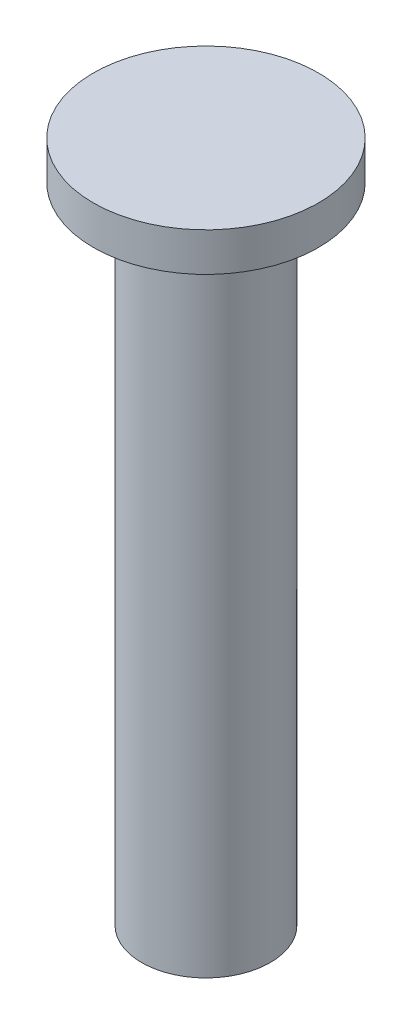
ISO-10303-21;
HEADER;
FILE_DESCRIPTION(('STEP AP214'),'2;1');
FILE_NAME('part.step','',(''),(''),'','','');
FILE_SCHEMA(('AUTOMOTIVE_DESIGN { 1 0 10303 214 1 1 1 1 }'));
ENDSEC;
DATA;
#1=APPLICATION_CONTEXT('core data for automotive mechanical design processes');
#2=APPLICATION_PROTOCOL_DEFINITION('international standard','automotive_design',2000,#1);
#3=PRODUCT_CONTEXT('',#1,'mechanical');
#4=PRODUCT('Part','Part','',(#3));
#5=PRODUCT_RELATED_PRODUCT_CATEGORY('part','',(#4));
#6=PRODUCT_DEFINITION_FORMATION('','',#4);
#7=PRODUCT_DEFINITION_CONTEXT('part definition',#1,'design');
#8=PRODUCT_DEFINITION('design','',#6,#7);
#9=PRODUCT_DEFINITION_SHAPE('','',#8);
#10=(LENGTH_UNIT() NAMED_UNIT(*) SI_UNIT(.MILLI.,.METRE.));
#11=(NAMED_UNIT(*) PLANE_ANGLE_UNIT() SI_UNIT($,.RADIAN.));
#12=(NAMED_UNIT(*) SI_UNIT($,.STERADIAN.) SOLID_ANGLE_UNIT());
#13=UNCERTAINTY_MEASURE_WITH_UNIT(LENGTH_MEASURE(1.E-05),#10,'distance_accuracy_value','');
#14=(GEOMETRIC_REPRESENTATION_CONTEXT(3) GLOBAL_UNCERTAINTY_ASSIGNED_CONTEXT((#13)) GLOBAL_UNIT_ASSIGNED_CONTEXT((#10,
#11,#12)) REPRESENTATION_CONTEXT('',''));
#15=CARTESIAN_POINT('',(0.,0.,0.));
#16=DIRECTION('',(0.,0.,1.));
#17=DIRECTION('',(1.,0.,0.));
#18=AXIS2_PLACEMENT_3D('',#15,#16,#17);
#19=CARTESIAN_POINT('',(0.,1.2,0.));
#20=DIRECTION('',(0.,-1.,0.));
#21=DIRECTION('',(0.,0.,-1.));
#22=AXIS2_PLACEMENT_3D('',#19,#20,#21);
#23=CYLINDRICAL_SURFACE('',#22,3.5);
#24=CARTESIAN_POINT('',(0.,1.2,0.));
#25=DIRECTION('',(0.,1.,0.));
#26=DIRECTION('',(0.,0.,1.));
#27=AXIS2_PLACEMENT_3D('',#24,#25,#26);
#28=CIRCLE('',#27,3.5);
#29=CARTESIAN_POINT('',(0.,1.2,3.5));
#30=VERTEX_POINT('',#29);
#31=EDGE_CURVE('E49',#30,#30,#28,.T.);
#32=ORIENTED_EDGE('',*,*,#31,.F.);
#33=EDGE_LOOP('',(#32));
#34=FACE_BOUND('',#33,.T.);
#35=CARTESIAN_POINT('',(0.,0.,0.));
#36=DIRECTION('',(0.,1.,0.));
#37=DIRECTION('',(0.,0.,1.));
#38=AXIS2_PLACEMENT_3D('',#35,#36,#37);
#39=CIRCLE('',#38,3.5);
#40=CARTESIAN_POINT('',(0.,0.,3.5));
#41=VERTEX_POINT('',#40);
#42=EDGE_CURVE('E44',#41,#41,#39,.T.);
#43=ORIENTED_EDGE('',*,*,#42,.T.);
#44=EDGE_LOOP('',(#43));
#45=FACE_BOUND('',#44,.T.);
#46=ADVANCED_FACE('F41',(#34,#45),#23,.T.);
#47=CARTESIAN_POINT('',(0.,1.2,0.));
#48=DIRECTION('',(0.,1.,0.));
#49=DIRECTION('',(0.,0.,1.));
#50=AXIS2_PLACEMENT_3D('',#47,#48,#49);
#51=PLANE('',#50);
#52=ORIENTED_EDGE('',*,*,#31,.T.);
#53=EDGE_LOOP('',(#52));
#54=FACE_BOUND('',#53,.T.);
#55=ADVANCED_FACE('F69',(#54),#51,.T.);
#56=CARTESIAN_POINT('',(0.,0.,0.));
#57=DIRECTION('',(0.,1.,0.));
#58=DIRECTION('',(0.,0.,1.));
#59=AXIS2_PLACEMENT_3D('',#56,#57,#58);
#60=PLANE('',#59);
#61=CARTESIAN_POINT('',(0.,0.,0.));
#62=DIRECTION('',(0.,-1.,0.));
#63=DIRECTION('',(0.,0.,-1.));
#64=AXIS2_PLACEMENT_3D('',#61,#62,#63);
#65=CIRCLE('',#64,2.);
#66=CARTESIAN_POINT('',(0.,0.,-2.));
#67=VERTEX_POINT('',#66);
#68=EDGE_CURVE('E10',#67,#67,#65,.T.);
#69=ORIENTED_EDGE('',*,*,#68,.F.);
#70=EDGE_LOOP('',(#69));
#71=FACE_BOUND('',#70,.T.);
#72=ORIENTED_EDGE('',*,*,#42,.F.);
#73=EDGE_LOOP('',(#72));
#74=FACE_BOUND('',#73,.T.);
#75=ADVANCED_FACE('F66',(#71,#74),#60,.F.);
#76=CARTESIAN_POINT('',(0.,-20.,0.));
#77=DIRECTION('',(0.,1.,0.));
#78=DIRECTION('',(0.,0.,1.));
#79=AXIS2_PLACEMENT_3D('',#76,#77,#78);
#80=CYLINDRICAL_SURFACE('',#79,2.);
#81=CARTESIAN_POINT('',(0.,-20.,0.));
#82=DIRECTION('',(0.,-1.,0.));
#83=DIRECTION('',(0.,0.,-1.));
#84=AXIS2_PLACEMENT_3D('',#81,#82,#83);
#85=CIRCLE('',#84,2.);
#86=CARTESIAN_POINT('',(0.,-20.,-2.));
#87=VERTEX_POINT('',#86);
#88=EDGE_CURVE('E56',#87,#87,#85,.T.);
#89=ORIENTED_EDGE('',*,*,#88,.F.);
#90=EDGE_LOOP('',(#89));
#91=FACE_BOUND('',#90,.T.);
#92=ORIENTED_EDGE('',*,*,#68,.T.);
#93=EDGE_LOOP('',(#92));
#94=FACE_BOUND('',#93,.T.);
#95=ADVANCED_FACE('F68',(#91,#94),#80,.T.);
#96=CARTESIAN_POINT('',(0.,-20.,0.));
#97=DIRECTION('',(0.,-1.,0.));
#98=DIRECTION('',(0.,0.,-1.));
#99=AXIS2_PLACEMENT_3D('',#96,#97,#98);
#100=PLANE('',#99);
#101=ORIENTED_EDGE('',*,*,#88,.T.);
#102=EDGE_LOOP('',(#101));
#103=FACE_BOUND('',#102,.T.);
#104=ADVANCED_FACE('F75',(#103),#100,.T.);
#105=CLOSED_SHELL('',(#46,#55,#75,#95,#104));
#106=MANIFOLD_SOLID_BREP('B2',#105);
#107=ADVANCED_BREP_SHAPE_REPRESENTATION('',(#18,#106),#14);
#108=SHAPE_DEFINITION_REPRESENTATION(#9,#107);
ENDSEC;
END-ISO-10303-21;
